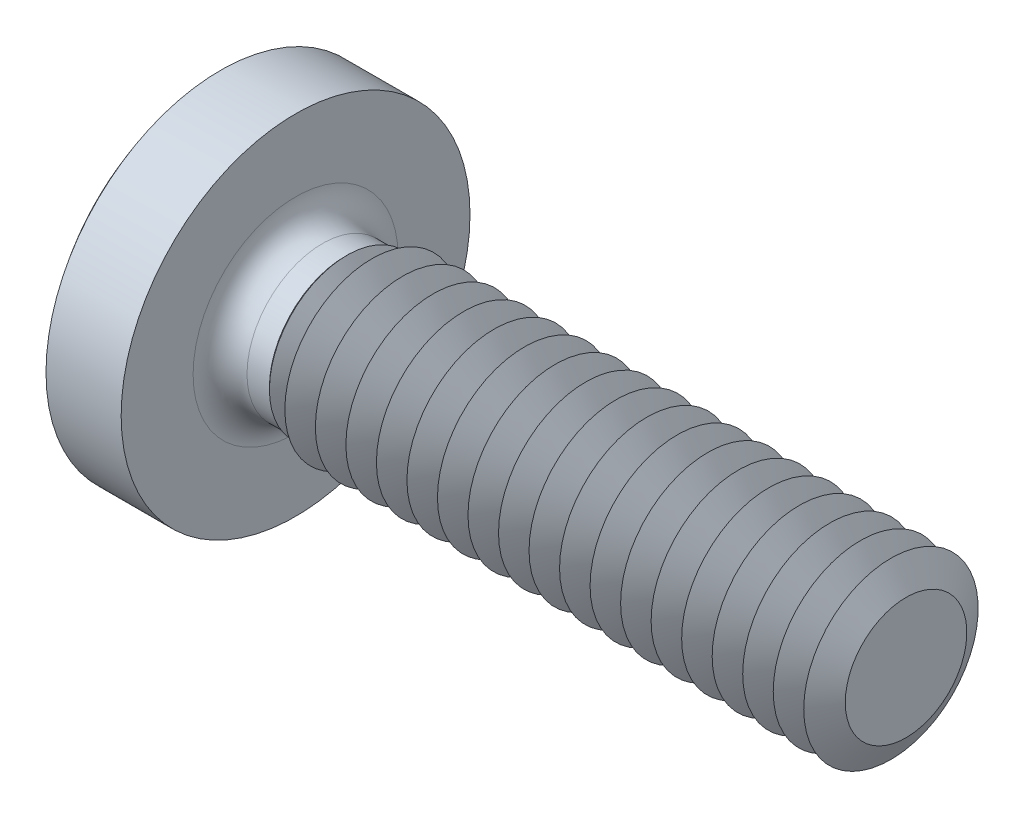
ISO-10303-21;
HEADER;
FILE_DESCRIPTION(('STEP AP214'),'2;1');
FILE_NAME('part.step','',(''),(''),'','','');
FILE_SCHEMA(('AUTOMOTIVE_DESIGN { 1 0 10303 214 1 1 1 1 }'));
ENDSEC;
DATA;
#1=APPLICATION_CONTEXT('core data for automotive mechanical design processes');
#2=APPLICATION_PROTOCOL_DEFINITION('international standard','automotive_design',2000,#1);
#3=PRODUCT_CONTEXT('',#1,'mechanical');
#4=PRODUCT('Part','Part','',(#3));
#5=PRODUCT_RELATED_PRODUCT_CATEGORY('part','',(#4));
#6=PRODUCT_DEFINITION_FORMATION('','',#4);
#7=PRODUCT_DEFINITION_CONTEXT('part definition',#1,'design');
#8=PRODUCT_DEFINITION('design','',#6,#7);
#9=PRODUCT_DEFINITION_SHAPE('','',#8);
#10=(LENGTH_UNIT() NAMED_UNIT(*) SI_UNIT(.MILLI.,.METRE.));
#11=(NAMED_UNIT(*) PLANE_ANGLE_UNIT() SI_UNIT($,.RADIAN.));
#12=(NAMED_UNIT(*) SI_UNIT($,.STERADIAN.) SOLID_ANGLE_UNIT());
#13=UNCERTAINTY_MEASURE_WITH_UNIT(LENGTH_MEASURE(1.E-05),#10,'distance_accuracy_value','');
#14=(GEOMETRIC_REPRESENTATION_CONTEXT(3) GLOBAL_UNCERTAINTY_ASSIGNED_CONTEXT((#13)) GLOBAL_UNIT_ASSIGNED_CONTEXT((#10,
#11,#12)) REPRESENTATION_CONTEXT('',''));
#15=CARTESIAN_POINT('',(0.,0.,0.));
#16=DIRECTION('',(0.,0.,1.));
#17=DIRECTION('',(1.,0.,0.));
#18=AXIS2_PLACEMENT_3D('',#15,#16,#17);
#19=CARTESIAN_POINT('',(2.4,0.,0.));
#20=DIRECTION('',(0.144306893071729,0.,-0.989532981063282));
#21=DIRECTION('',(-0.989532981063282,0.,-0.144306893071729));
#22=AXIS2_PLACEMENT_3D('',#19,#20,#21);
#23=PLANE('',#22);
#24=DIRECTION('',(-0.732931208059297,-0.671853607387689,-0.106885801175314));
#25=VECTOR('',#24,1.);
#26=CARTESIAN_POINT('',(2.4,0.,0.));
#27=LINE('',#26,#25);
#28=CARTESIAN_POINT('',(2.4,0.,0.));
#29=VERTEX_POINT('',#28);
#30=CARTESIAN_POINT('',(0.299339193338267,-1.92560573943992,-0.30634636763817));
#31=VERTEX_POINT('',#30);
#32=EDGE_CURVE('E160',#29,#31,#27,.T.);
#33=ORIENTED_EDGE('',*,*,#32,.F.);
#34=DIRECTION('',(-0.979387903800927,-0.142827402637635,-0.142827402637635));
#35=VECTOR('',#34,1.);
#36=CARTESIAN_POINT('',(2.4,0.,0.));
#37=LINE('',#36,#35);
#38=CARTESIAN_POINT('',(0.0185820115886168,-0.347290123309992,-0.347290123309993));
#39=VERTEX_POINT('',#38);
#40=EDGE_CURVE('E121',#29,#39,#37,.T.);
#41=ORIENTED_EDGE('',*,*,#40,.T.);
#42=CARTESIAN_POINT('',(6.41461963450914,0.,0.585465363365916));
#43=DIRECTION('',(0.144306893071729,0.,-0.989532981063282));
#44=DIRECTION('',(-0.989532981063282,0.,-0.144306893071729));
#45=AXIS2_PLACEMENT_3D('',#42,#43,#44);
#46=CIRCLE('',#45,6.47301633718682);
#47=EDGE_CURVE('E134',#31,#39,#46,.T.);
#48=ORIENTED_EDGE('',*,*,#47,.F.);
#49=EDGE_LOOP('',(#33,#41,#48));
#50=FACE_BOUND('',#49,.T.);
#51=ADVANCED_FACE('F41',(#50),#23,.F.);
#52=CARTESIAN_POINT('',(2.4,0.,0.));
#53=DIRECTION('',(0.144306893071729,0.,0.989532981063282));
#54=DIRECTION('',(0.989532981063282,0.,-0.144306893071729));
#55=AXIS2_PLACEMENT_3D('',#52,#53,#54);
#56=PLANE('',#55);
#57=CARTESIAN_POINT('',(6.41461963450914,0.,-0.585465363365916));
#58=DIRECTION('',(0.144306893071729,0.,0.989532981063282));
#59=DIRECTION('',(0.989532981063282,0.,-0.144306893071729));
#60=AXIS2_PLACEMENT_3D('',#57,#58,#59);
#61=CIRCLE('',#60,6.47301633718682);
#62=CARTESIAN_POINT('',(0.0185820115886177,-0.347290123309995,0.347290123309993));
#63=VERTEX_POINT('',#62);
#64=CARTESIAN_POINT('',(0.299339193338266,-1.92560573943992,0.30634636763817));
#65=VERTEX_POINT('',#64);
#66=EDGE_CURVE('E64',#63,#65,#61,.T.);
#67=ORIENTED_EDGE('',*,*,#66,.F.);
#68=DIRECTION('',(0.979387903800927,0.142827402637636,-0.142827402637635));
#69=VECTOR('',#68,1.);
#70=CARTESIAN_POINT('',(2.4,0.,0.));
#71=LINE('',#70,#69);
#72=EDGE_CURVE('E11',#63,#29,#71,.T.);
#73=ORIENTED_EDGE('',*,*,#72,.T.);
#74=DIRECTION('',(-0.732931208059297,-0.671853607387689,0.106885801175314));
#75=VECTOR('',#74,1.);
#76=CARTESIAN_POINT('',(2.4,0.,0.));
#77=LINE('',#76,#75);
#78=EDGE_CURVE('E161',#29,#65,#77,.T.);
#79=ORIENTED_EDGE('',*,*,#78,.T.);
#80=EDGE_LOOP('',(#67,#73,#79));
#81=FACE_BOUND('',#80,.T.);
#82=ADVANCED_FACE('F176',(#81),#56,.F.);
#83=CARTESIAN_POINT('',(14.6537912040211,0.,0.));
#84=DIRECTION('',(-1.,0.,0.));
#85=DIRECTION('',(0.,0.,1.));
#86=AXIS2_PLACEMENT_3D('',#83,#84,#85);
#87=CONICAL_SURFACE('',#86,2.,1.05188801855302);
#88=CARTESIAN_POINT('',(15.,0.,0.));
#89=DIRECTION('',(-1.,0.,0.));
#90=DIRECTION('',(0.,0.,1.));
#91=AXIS2_PLACEMENT_3D('',#88,#89,#90);
#92=CIRCLE('',#91,1.3938);
#93=CARTESIAN_POINT('',(15.,0.,1.3938));
#94=VERTEX_POINT('',#93);
#95=EDGE_CURVE('E282',#94,#94,#92,.T.);
#96=ORIENTED_EDGE('',*,*,#95,.T.);
#97=EDGE_LOOP('',(#96));
#98=FACE_BOUND('',#97,.T.);
#99=CARTESIAN_POINT('',(14.6537912040211,0.,0.));
#100=DIRECTION('',(-1.,0.,0.));
#101=DIRECTION('',(0.,0.,1.));
#102=AXIS2_PLACEMENT_3D('',#99,#100,#101);
#103=CIRCLE('',#102,2.);
#104=CARTESIAN_POINT('',(14.6537912040211,0.,2.));
#105=VERTEX_POINT('',#104);
#106=EDGE_CURVE('E279',#105,#105,#103,.T.);
#107=ORIENTED_EDGE('',*,*,#106,.F.);
#108=EDGE_LOOP('',(#107));
#109=FACE_BOUND('',#108,.T.);
#110=ADVANCED_FACE('F365',(#98,#109),#87,.T.);
#111=CARTESIAN_POINT('',(15.,0.,0.));
#112=DIRECTION('',(1.,0.,0.));
#113=DIRECTION('',(0.,0.,-1.));
#114=AXIS2_PLACEMENT_3D('',#111,#112,#113);
#115=CONICAL_SURFACE('',#114,1.3938,1.04250708384017);
#116=CARTESIAN_POINT('',(15.3537912040211,0.,0.));
#117=DIRECTION('',(-1.,0.,0.));
#118=DIRECTION('',(0.,0.,1.));
#119=AXIS2_PLACEMENT_3D('',#116,#117,#118);
#120=CIRCLE('',#119,2.);
#121=CARTESIAN_POINT('',(15.3537912040211,0.,2.));
#122=VERTEX_POINT('',#121);
#123=EDGE_CURVE('E285',#122,#122,#120,.T.);
#124=ORIENTED_EDGE('',*,*,#123,.T.);
#125=EDGE_LOOP('',(#124));
#126=FACE_BOUND('',#125,.T.);
#127=ORIENTED_EDGE('',*,*,#95,.F.);
#128=EDGE_LOOP('',(#127));
#129=FACE_BOUND('',#128,.T.);
#130=ADVANCED_FACE('F822',(#126,#129),#115,.T.);
#131=CARTESIAN_POINT('',(17.1,0.,0.));
#132=DIRECTION('',(-1.,0.,0.));
#133=DIRECTION('',(0.,0.,1.));
#134=AXIS2_PLACEMENT_3D('',#131,#132,#133);
#135=PLANE('',#134);
#136=CARTESIAN_POINT('',(17.1,0.,0.));
#137=DIRECTION('',(-1.,0.,0.));
#138=DIRECTION('',(0.,0.,1.));
#139=AXIS2_PLACEMENT_3D('',#136,#137,#138);
#140=CIRCLE('',#139,1.3938);
#141=CARTESIAN_POINT('',(17.1,0.,1.3938));
#142=VERTEX_POINT('',#141);
#143=EDGE_CURVE('E300',#142,#142,#140,.T.);
#144=ORIENTED_EDGE('',*,*,#143,.F.);
#145=EDGE_LOOP('',(#144));
#146=FACE_BOUND('',#145,.T.);
#147=ADVANCED_FACE('F826',(#146),#135,.F.);
#148=CARTESIAN_POINT('',(16.7537912040211,0.,0.));
#149=DIRECTION('',(-1.,0.,0.));
#150=DIRECTION('',(0.,0.,1.));
#151=AXIS2_PLACEMENT_3D('',#148,#149,#150);
#152=CONICAL_SURFACE('',#151,2.,1.05188801855302);
#153=ORIENTED_EDGE('',*,*,#143,.T.);
#154=EDGE_LOOP('',(#153));
#155=FACE_BOUND('',#154,.T.);
#156=CARTESIAN_POINT('',(16.7537912040211,0.,0.));
#157=DIRECTION('',(-1.,0.,0.));
#158=DIRECTION('',(0.,0.,1.));
#159=AXIS2_PLACEMENT_3D('',#156,#157,#158);
#160=CIRCLE('',#159,2.);
#161=CARTESIAN_POINT('',(16.7537912040211,0.,2.));
#162=VERTEX_POINT('',#161);
#163=EDGE_CURVE('E297',#162,#162,#160,.T.);
#164=ORIENTED_EDGE('',*,*,#163,.F.);
#165=EDGE_LOOP('',(#164));
#166=FACE_BOUND('',#165,.T.);
#167=ADVANCED_FACE('F813',(#155,#166),#152,.T.);
#168=CARTESIAN_POINT('',(16.4,0.,0.));
#169=DIRECTION('',(1.,0.,0.));
#170=DIRECTION('',(0.,0.,-1.));
#171=AXIS2_PLACEMENT_3D('',#168,#169,#170);
#172=CONICAL_SURFACE('',#171,1.3938,1.04250708384017);
#173=ORIENTED_EDGE('',*,*,#163,.T.);
#174=EDGE_LOOP('',(#173));
#175=FACE_BOUND('',#174,.T.);
#176=CARTESIAN_POINT('',(16.4,0.,0.));
#177=DIRECTION('',(-1.,0.,0.));
#178=DIRECTION('',(0.,0.,1.));
#179=AXIS2_PLACEMENT_3D('',#176,#177,#178);
#180=CIRCLE('',#179,1.3938);
#181=CARTESIAN_POINT('',(16.4,0.,1.3938));
#182=VERTEX_POINT('',#181);
#183=EDGE_CURVE('E294',#182,#182,#180,.T.);
#184=ORIENTED_EDGE('',*,*,#183,.F.);
#185=EDGE_LOOP('',(#184));
#186=FACE_BOUND('',#185,.T.);
#187=ADVANCED_FACE('F802',(#175,#186),#172,.T.);
#188=CARTESIAN_POINT('',(16.0537912040211,0.,0.));
#189=DIRECTION('',(-1.,0.,0.));
#190=DIRECTION('',(0.,0.,1.));
#191=AXIS2_PLACEMENT_3D('',#188,#189,#190);
#192=CONICAL_SURFACE('',#191,2.,1.05188801855302);
#193=ORIENTED_EDGE('',*,*,#183,.T.);
#194=EDGE_LOOP('',(#193));
#195=FACE_BOUND('',#194,.T.);
#196=CARTESIAN_POINT('',(16.0537912040211,0.,0.));
#197=DIRECTION('',(-1.,0.,0.));
#198=DIRECTION('',(0.,0.,1.));
#199=AXIS2_PLACEMENT_3D('',#196,#197,#198);
#200=CIRCLE('',#199,2.);
#201=CARTESIAN_POINT('',(16.0537912040211,0.,2.));
#202=VERTEX_POINT('',#201);
#203=EDGE_CURVE('E291',#202,#202,#200,.T.);
#204=ORIENTED_EDGE('',*,*,#203,.F.);
#205=EDGE_LOOP('',(#204));
#206=FACE_BOUND('',#205,.T.);
#207=ADVANCED_FACE('F791',(#195,#206),#192,.T.);
#208=CARTESIAN_POINT('',(15.7,0.,0.));
#209=DIRECTION('',(1.,0.,0.));
#210=DIRECTION('',(0.,0.,-1.));
#211=AXIS2_PLACEMENT_3D('',#208,#209,#210);
#212=CONICAL_SURFACE('',#211,1.3938,1.04250708384017);
#213=ORIENTED_EDGE('',*,*,#203,.T.);
#214=EDGE_LOOP('',(#213));
#215=FACE_BOUND('',#214,.T.);
#216=CARTESIAN_POINT('',(15.7,0.,0.));
#217=DIRECTION('',(-1.,0.,0.));
#218=DIRECTION('',(0.,0.,1.));
#219=AXIS2_PLACEMENT_3D('',#216,#217,#218);
#220=CIRCLE('',#219,1.3938);
#221=CARTESIAN_POINT('',(15.7,0.,1.3938));
#222=VERTEX_POINT('',#221);
#223=EDGE_CURVE('E288',#222,#222,#220,.T.);
#224=ORIENTED_EDGE('',*,*,#223,.F.);
#225=EDGE_LOOP('',(#224));
#226=FACE_BOUND('',#225,.T.);
#227=ADVANCED_FACE('F780',(#215,#226),#212,.T.);
#228=CARTESIAN_POINT('',(15.3537912040211,0.,0.));
#229=DIRECTION('',(-1.,0.,0.));
#230=DIRECTION('',(0.,0.,1.));
#231=AXIS2_PLACEMENT_3D('',#228,#229,#230);
#232=CONICAL_SURFACE('',#231,2.,1.05188801855302);
#233=ORIENTED_EDGE('',*,*,#223,.T.);
#234=EDGE_LOOP('',(#233));
#235=FACE_BOUND('',#234,.T.);
#236=ORIENTED_EDGE('',*,*,#123,.F.);
#237=EDGE_LOOP('',(#236));
#238=FACE_BOUND('',#237,.T.);
#239=ADVANCED_FACE('F769',(#235,#238),#232,.T.);
#240=CARTESIAN_POINT('',(13.9537912040211,0.,0.));
#241=DIRECTION('',(-1.,0.,0.));
#242=DIRECTION('',(0.,0.,1.));
#243=AXIS2_PLACEMENT_3D('',#240,#241,#242);
#244=CONICAL_SURFACE('',#243,2.,1.05188801855302);
#245=CARTESIAN_POINT('',(14.3,0.,0.));
#246=DIRECTION('',(-1.,0.,0.));
#247=DIRECTION('',(0.,0.,1.));
#248=AXIS2_PLACEMENT_3D('',#245,#246,#247);
#249=CIRCLE('',#248,1.3938);
#250=CARTESIAN_POINT('',(14.3,0.,1.3938));
#251=VERTEX_POINT('',#250);
#252=EDGE_CURVE('E276',#251,#251,#249,.T.);
#253=ORIENTED_EDGE('',*,*,#252,.T.);
#254=EDGE_LOOP('',(#253));
#255=FACE_BOUND('',#254,.T.);
#256=CARTESIAN_POINT('',(13.9537912040211,0.,0.));
#257=DIRECTION('',(-1.,0.,0.));
#258=DIRECTION('',(0.,0.,1.));
#259=AXIS2_PLACEMENT_3D('',#256,#257,#258);
#260=CIRCLE('',#259,2.);
#261=CARTESIAN_POINT('',(13.9537912040211,0.,2.));
#262=VERTEX_POINT('',#261);
#263=EDGE_CURVE('E273',#262,#262,#260,.T.);
#264=ORIENTED_EDGE('',*,*,#263,.F.);
#265=EDGE_LOOP('',(#264));
#266=FACE_BOUND('',#265,.T.);
#267=ADVANCED_FACE('F758',(#255,#266),#244,.T.);
#268=CARTESIAN_POINT('',(14.3,0.,0.));
#269=DIRECTION('',(1.,0.,0.));
#270=DIRECTION('',(0.,0.,-1.));
#271=AXIS2_PLACEMENT_3D('',#268,#269,#270);
#272=CONICAL_SURFACE('',#271,1.3938,1.04250708384017);
#273=ORIENTED_EDGE('',*,*,#106,.T.);
#274=EDGE_LOOP('',(#273));
#275=FACE_BOUND('',#274,.T.);
#276=ORIENTED_EDGE('',*,*,#252,.F.);
#277=EDGE_LOOP('',(#276));
#278=FACE_BOUND('',#277,.T.);
#279=ADVANCED_FACE('F747',(#275,#278),#272,.T.);
#280=CARTESIAN_POINT('',(13.2537912040211,0.,0.));
#281=DIRECTION('',(-1.,0.,0.));
#282=DIRECTION('',(0.,0.,1.));
#283=AXIS2_PLACEMENT_3D('',#280,#281,#282);
#284=CONICAL_SURFACE('',#283,2.,1.05188801855302);
#285=CARTESIAN_POINT('',(13.6,0.,0.));
#286=DIRECTION('',(-1.,0.,0.));
#287=DIRECTION('',(0.,0.,1.));
#288=AXIS2_PLACEMENT_3D('',#285,#286,#287);
#289=CIRCLE('',#288,1.3938);
#290=CARTESIAN_POINT('',(13.6,0.,1.3938));
#291=VERTEX_POINT('',#290);
#292=EDGE_CURVE('E270',#291,#291,#289,.T.);
#293=ORIENTED_EDGE('',*,*,#292,.T.);
#294=EDGE_LOOP('',(#293));
#295=FACE_BOUND('',#294,.T.);
#296=CARTESIAN_POINT('',(13.2537912040211,0.,0.));
#297=DIRECTION('',(-1.,0.,0.));
#298=DIRECTION('',(0.,0.,1.));
#299=AXIS2_PLACEMENT_3D('',#296,#297,#298);
#300=CIRCLE('',#299,2.);
#301=CARTESIAN_POINT('',(13.2537912040211,0.,2.));
#302=VERTEX_POINT('',#301);
#303=EDGE_CURVE('E267',#302,#302,#300,.T.);
#304=ORIENTED_EDGE('',*,*,#303,.F.);
#305=EDGE_LOOP('',(#304));
#306=FACE_BOUND('',#305,.T.);
#307=ADVANCED_FACE('F736',(#295,#306),#284,.T.);
#308=CARTESIAN_POINT('',(13.6,0.,0.));
#309=DIRECTION('',(1.,0.,0.));
#310=DIRECTION('',(0.,0.,-1.));
#311=AXIS2_PLACEMENT_3D('',#308,#309,#310);
#312=CONICAL_SURFACE('',#311,1.3938,1.04250708384017);
#313=ORIENTED_EDGE('',*,*,#263,.T.);
#314=EDGE_LOOP('',(#313));
#315=FACE_BOUND('',#314,.T.);
#316=ORIENTED_EDGE('',*,*,#292,.F.);
#317=EDGE_LOOP('',(#316));
#318=FACE_BOUND('',#317,.T.);
#319=ADVANCED_FACE('F725',(#315,#318),#312,.T.);
#320=CARTESIAN_POINT('',(12.5537912040211,0.,0.));
#321=DIRECTION('',(-1.,0.,0.));
#322=DIRECTION('',(0.,0.,1.));
#323=AXIS2_PLACEMENT_3D('',#320,#321,#322);
#324=CONICAL_SURFACE('',#323,2.,1.05188801855302);
#325=CARTESIAN_POINT('',(12.9,0.,0.));
#326=DIRECTION('',(-1.,0.,0.));
#327=DIRECTION('',(0.,0.,1.));
#328=AXIS2_PLACEMENT_3D('',#325,#326,#327);
#329=CIRCLE('',#328,1.3938);
#330=CARTESIAN_POINT('',(12.9,0.,1.3938));
#331=VERTEX_POINT('',#330);
#332=EDGE_CURVE('E264',#331,#331,#329,.T.);
#333=ORIENTED_EDGE('',*,*,#332,.T.);
#334=EDGE_LOOP('',(#333));
#335=FACE_BOUND('',#334,.T.);
#336=CARTESIAN_POINT('',(12.5537912040211,0.,0.));
#337=DIRECTION('',(-1.,0.,0.));
#338=DIRECTION('',(0.,0.,1.));
#339=AXIS2_PLACEMENT_3D('',#336,#337,#338);
#340=CIRCLE('',#339,2.);
#341=CARTESIAN_POINT('',(12.5537912040211,0.,2.));
#342=VERTEX_POINT('',#341);
#343=EDGE_CURVE('E261',#342,#342,#340,.T.);
#344=ORIENTED_EDGE('',*,*,#343,.F.);
#345=EDGE_LOOP('',(#344));
#346=FACE_BOUND('',#345,.T.);
#347=ADVANCED_FACE('F714',(#335,#346),#324,.T.);
#348=CARTESIAN_POINT('',(12.9,0.,0.));
#349=DIRECTION('',(1.,0.,0.));
#350=DIRECTION('',(0.,0.,-1.));
#351=AXIS2_PLACEMENT_3D('',#348,#349,#350);
#352=CONICAL_SURFACE('',#351,1.3938,1.04250708384017);
#353=ORIENTED_EDGE('',*,*,#303,.T.);
#354=EDGE_LOOP('',(#353));
#355=FACE_BOUND('',#354,.T.);
#356=ORIENTED_EDGE('',*,*,#332,.F.);
#357=EDGE_LOOP('',(#356));
#358=FACE_BOUND('',#357,.T.);
#359=ADVANCED_FACE('F703',(#355,#358),#352,.T.);
#360=CARTESIAN_POINT('',(11.8537912040211,0.,0.));
#361=DIRECTION('',(-1.,0.,0.));
#362=DIRECTION('',(0.,0.,1.));
#363=AXIS2_PLACEMENT_3D('',#360,#361,#362);
#364=CONICAL_SURFACE('',#363,2.,1.05188801855302);
#365=CARTESIAN_POINT('',(12.2,0.,0.));
#366=DIRECTION('',(-1.,0.,0.));
#367=DIRECTION('',(0.,0.,1.));
#368=AXIS2_PLACEMENT_3D('',#365,#366,#367);
#369=CIRCLE('',#368,1.3938);
#370=CARTESIAN_POINT('',(12.2,0.,1.3938));
#371=VERTEX_POINT('',#370);
#372=EDGE_CURVE('E258',#371,#371,#369,.T.);
#373=ORIENTED_EDGE('',*,*,#372,.T.);
#374=EDGE_LOOP('',(#373));
#375=FACE_BOUND('',#374,.T.);
#376=CARTESIAN_POINT('',(11.8537912040211,0.,0.));
#377=DIRECTION('',(-1.,0.,0.));
#378=DIRECTION('',(0.,0.,1.));
#379=AXIS2_PLACEMENT_3D('',#376,#377,#378);
#380=CIRCLE('',#379,2.);
#381=CARTESIAN_POINT('',(11.8537912040211,0.,2.));
#382=VERTEX_POINT('',#381);
#383=EDGE_CURVE('E255',#382,#382,#380,.T.);
#384=ORIENTED_EDGE('',*,*,#383,.F.);
#385=EDGE_LOOP('',(#384));
#386=FACE_BOUND('',#385,.T.);
#387=ADVANCED_FACE('F692',(#375,#386),#364,.T.);
#388=CARTESIAN_POINT('',(12.2,0.,0.));
#389=DIRECTION('',(1.,0.,0.));
#390=DIRECTION('',(0.,0.,-1.));
#391=AXIS2_PLACEMENT_3D('',#388,#389,#390);
#392=CONICAL_SURFACE('',#391,1.3938,1.04250708384017);
#393=ORIENTED_EDGE('',*,*,#343,.T.);
#394=EDGE_LOOP('',(#393));
#395=FACE_BOUND('',#394,.T.);
#396=ORIENTED_EDGE('',*,*,#372,.F.);
#397=EDGE_LOOP('',(#396));
#398=FACE_BOUND('',#397,.T.);
#399=ADVANCED_FACE('F681',(#395,#398),#392,.T.);
#400=CARTESIAN_POINT('',(11.1537912040211,0.,0.));
#401=DIRECTION('',(-1.,0.,0.));
#402=DIRECTION('',(0.,0.,1.));
#403=AXIS2_PLACEMENT_3D('',#400,#401,#402);
#404=CONICAL_SURFACE('',#403,2.,1.05188801855302);
#405=CARTESIAN_POINT('',(11.5,0.,0.));
#406=DIRECTION('',(-1.,0.,0.));
#407=DIRECTION('',(0.,0.,1.));
#408=AXIS2_PLACEMENT_3D('',#405,#406,#407);
#409=CIRCLE('',#408,1.3938);
#410=CARTESIAN_POINT('',(11.5,0.,1.3938));
#411=VERTEX_POINT('',#410);
#412=EDGE_CURVE('E252',#411,#411,#409,.T.);
#413=ORIENTED_EDGE('',*,*,#412,.T.);
#414=EDGE_LOOP('',(#413));
#415=FACE_BOUND('',#414,.T.);
#416=CARTESIAN_POINT('',(11.1537912040211,0.,0.));
#417=DIRECTION('',(-1.,0.,0.));
#418=DIRECTION('',(0.,0.,1.));
#419=AXIS2_PLACEMENT_3D('',#416,#417,#418);
#420=CIRCLE('',#419,2.);
#421=CARTESIAN_POINT('',(11.1537912040211,0.,2.));
#422=VERTEX_POINT('',#421);
#423=EDGE_CURVE('E249',#422,#422,#420,.T.);
#424=ORIENTED_EDGE('',*,*,#423,.F.);
#425=EDGE_LOOP('',(#424));
#426=FACE_BOUND('',#425,.T.);
#427=ADVANCED_FACE('F670',(#415,#426),#404,.T.);
#428=CARTESIAN_POINT('',(11.5,0.,0.));
#429=DIRECTION('',(1.,0.,0.));
#430=DIRECTION('',(0.,0.,-1.));
#431=AXIS2_PLACEMENT_3D('',#428,#429,#430);
#432=CONICAL_SURFACE('',#431,1.3938,1.04250708384017);
#433=ORIENTED_EDGE('',*,*,#383,.T.);
#434=EDGE_LOOP('',(#433));
#435=FACE_BOUND('',#434,.T.);
#436=ORIENTED_EDGE('',*,*,#412,.F.);
#437=EDGE_LOOP('',(#436));
#438=FACE_BOUND('',#437,.T.);
#439=ADVANCED_FACE('F659',(#435,#438),#432,.T.);
#440=CARTESIAN_POINT('',(10.4537912040211,0.,0.));
#441=DIRECTION('',(-1.,0.,0.));
#442=DIRECTION('',(0.,0.,1.));
#443=AXIS2_PLACEMENT_3D('',#440,#441,#442);
#444=CONICAL_SURFACE('',#443,2.,1.05188801855302);
#445=CARTESIAN_POINT('',(10.8,0.,0.));
#446=DIRECTION('',(-1.,0.,0.));
#447=DIRECTION('',(0.,0.,1.));
#448=AXIS2_PLACEMENT_3D('',#445,#446,#447);
#449=CIRCLE('',#448,1.3938);
#450=CARTESIAN_POINT('',(10.8,0.,1.3938));
#451=VERTEX_POINT('',#450);
#452=EDGE_CURVE('E246',#451,#451,#449,.T.);
#453=ORIENTED_EDGE('',*,*,#452,.T.);
#454=EDGE_LOOP('',(#453));
#455=FACE_BOUND('',#454,.T.);
#456=CARTESIAN_POINT('',(10.4537912040211,0.,0.));
#457=DIRECTION('',(-1.,0.,0.));
#458=DIRECTION('',(0.,0.,1.));
#459=AXIS2_PLACEMENT_3D('',#456,#457,#458);
#460=CIRCLE('',#459,2.);
#461=CARTESIAN_POINT('',(10.4537912040211,0.,2.));
#462=VERTEX_POINT('',#461);
#463=EDGE_CURVE('E243',#462,#462,#460,.T.);
#464=ORIENTED_EDGE('',*,*,#463,.F.);
#465=EDGE_LOOP('',(#464));
#466=FACE_BOUND('',#465,.T.);
#467=ADVANCED_FACE('F648',(#455,#466),#444,.T.);
#468=CARTESIAN_POINT('',(10.8,0.,0.));
#469=DIRECTION('',(1.,0.,0.));
#470=DIRECTION('',(0.,0.,-1.));
#471=AXIS2_PLACEMENT_3D('',#468,#469,#470);
#472=CONICAL_SURFACE('',#471,1.3938,1.04250708384017);
#473=ORIENTED_EDGE('',*,*,#423,.T.);
#474=EDGE_LOOP('',(#473));
#475=FACE_BOUND('',#474,.T.);
#476=ORIENTED_EDGE('',*,*,#452,.F.);
#477=EDGE_LOOP('',(#476));
#478=FACE_BOUND('',#477,.T.);
#479=ADVANCED_FACE('F637',(#475,#478),#472,.T.);
#480=CARTESIAN_POINT('',(9.75379120402108,0.,0.));
#481=DIRECTION('',(-1.,0.,0.));
#482=DIRECTION('',(0.,0.,1.));
#483=AXIS2_PLACEMENT_3D('',#480,#481,#482);
#484=CONICAL_SURFACE('',#483,2.,1.05188801855302);
#485=CARTESIAN_POINT('',(10.1,0.,0.));
#486=DIRECTION('',(-1.,0.,0.));
#487=DIRECTION('',(0.,0.,1.));
#488=AXIS2_PLACEMENT_3D('',#485,#486,#487);
#489=CIRCLE('',#488,1.3938);
#490=CARTESIAN_POINT('',(10.1,0.,1.3938));
#491=VERTEX_POINT('',#490);
#492=EDGE_CURVE('E240',#491,#491,#489,.T.);
#493=ORIENTED_EDGE('',*,*,#492,.T.);
#494=EDGE_LOOP('',(#493));
#495=FACE_BOUND('',#494,.T.);
#496=CARTESIAN_POINT('',(9.75379120402108,0.,0.));
#497=DIRECTION('',(-1.,0.,0.));
#498=DIRECTION('',(0.,0.,1.));
#499=AXIS2_PLACEMENT_3D('',#496,#497,#498);
#500=CIRCLE('',#499,2.);
#501=CARTESIAN_POINT('',(9.75379120402108,0.,2.));
#502=VERTEX_POINT('',#501);
#503=EDGE_CURVE('E237',#502,#502,#500,.T.);
#504=ORIENTED_EDGE('',*,*,#503,.F.);
#505=EDGE_LOOP('',(#504));
#506=FACE_BOUND('',#505,.T.);
#507=ADVANCED_FACE('F626',(#495,#506),#484,.T.);
#508=CARTESIAN_POINT('',(10.1,0.,0.));
#509=DIRECTION('',(1.,0.,0.));
#510=DIRECTION('',(0.,0.,-1.));
#511=AXIS2_PLACEMENT_3D('',#508,#509,#510);
#512=CONICAL_SURFACE('',#511,1.3938,1.04250708384017);
#513=ORIENTED_EDGE('',*,*,#463,.T.);
#514=EDGE_LOOP('',(#513));
#515=FACE_BOUND('',#514,.T.);
#516=ORIENTED_EDGE('',*,*,#492,.F.);
#517=EDGE_LOOP('',(#516));
#518=FACE_BOUND('',#517,.T.);
#519=ADVANCED_FACE('F615',(#515,#518),#512,.T.);
#520=CARTESIAN_POINT('',(9.05379120402107,0.,0.));
#521=DIRECTION('',(-1.,0.,0.));
#522=DIRECTION('',(0.,0.,1.));
#523=AXIS2_PLACEMENT_3D('',#520,#521,#522);
#524=CONICAL_SURFACE('',#523,2.,1.05188801855302);
#525=CARTESIAN_POINT('',(9.4,0.,0.));
#526=DIRECTION('',(-1.,0.,0.));
#527=DIRECTION('',(0.,0.,1.));
#528=AXIS2_PLACEMENT_3D('',#525,#526,#527);
#529=CIRCLE('',#528,1.3938);
#530=CARTESIAN_POINT('',(9.4,0.,1.3938));
#531=VERTEX_POINT('',#530);
#532=EDGE_CURVE('E234',#531,#531,#529,.T.);
#533=ORIENTED_EDGE('',*,*,#532,.T.);
#534=EDGE_LOOP('',(#533));
#535=FACE_BOUND('',#534,.T.);
#536=CARTESIAN_POINT('',(9.05379120402108,0.,0.));
#537=DIRECTION('',(-1.,0.,0.));
#538=DIRECTION('',(0.,0.,1.));
#539=AXIS2_PLACEMENT_3D('',#536,#537,#538);
#540=CIRCLE('',#539,2.);
#541=CARTESIAN_POINT('',(9.05379120402108,0.,2.));
#542=VERTEX_POINT('',#541);
#543=EDGE_CURVE('E231',#542,#542,#540,.T.);
#544=ORIENTED_EDGE('',*,*,#543,.F.);
#545=EDGE_LOOP('',(#544));
#546=FACE_BOUND('',#545,.T.);
#547=ADVANCED_FACE('F604',(#535,#546),#524,.T.);
#548=CARTESIAN_POINT('',(9.4,0.,0.));
#549=DIRECTION('',(1.,0.,0.));
#550=DIRECTION('',(0.,0.,-1.));
#551=AXIS2_PLACEMENT_3D('',#548,#549,#550);
#552=CONICAL_SURFACE('',#551,1.3938,1.04250708384017);
#553=ORIENTED_EDGE('',*,*,#503,.T.);
#554=EDGE_LOOP('',(#553));
#555=FACE_BOUND('',#554,.T.);
#556=ORIENTED_EDGE('',*,*,#532,.F.);
#557=EDGE_LOOP('',(#556));
#558=FACE_BOUND('',#557,.T.);
#559=ADVANCED_FACE('F593',(#555,#558),#552,.T.);
#560=CARTESIAN_POINT('',(8.35379120402107,0.,0.));
#561=DIRECTION('',(-1.,0.,0.));
#562=DIRECTION('',(0.,0.,1.));
#563=AXIS2_PLACEMENT_3D('',#560,#561,#562);
#564=CONICAL_SURFACE('',#563,2.,1.05188801855302);
#565=CARTESIAN_POINT('',(8.7,0.,0.));
#566=DIRECTION('',(-1.,0.,0.));
#567=DIRECTION('',(0.,0.,1.));
#568=AXIS2_PLACEMENT_3D('',#565,#566,#567);
#569=CIRCLE('',#568,1.3938);
#570=CARTESIAN_POINT('',(8.7,0.,1.3938));
#571=VERTEX_POINT('',#570);
#572=EDGE_CURVE('E228',#571,#571,#569,.T.);
#573=ORIENTED_EDGE('',*,*,#572,.T.);
#574=EDGE_LOOP('',(#573));
#575=FACE_BOUND('',#574,.T.);
#576=CARTESIAN_POINT('',(8.35379120402108,0.,0.));
#577=DIRECTION('',(-1.,0.,0.));
#578=DIRECTION('',(0.,0.,1.));
#579=AXIS2_PLACEMENT_3D('',#576,#577,#578);
#580=CIRCLE('',#579,2.);
#581=CARTESIAN_POINT('',(8.35379120402108,0.,2.));
#582=VERTEX_POINT('',#581);
#583=EDGE_CURVE('E225',#582,#582,#580,.T.);
#584=ORIENTED_EDGE('',*,*,#583,.F.);
#585=EDGE_LOOP('',(#584));
#586=FACE_BOUND('',#585,.T.);
#587=ADVANCED_FACE('F582',(#575,#586),#564,.T.);
#588=CARTESIAN_POINT('',(8.7,0.,0.));
#589=DIRECTION('',(1.,0.,0.));
#590=DIRECTION('',(0.,0.,-1.));
#591=AXIS2_PLACEMENT_3D('',#588,#589,#590);
#592=CONICAL_SURFACE('',#591,1.3938,1.04250708384017);
#593=ORIENTED_EDGE('',*,*,#543,.T.);
#594=EDGE_LOOP('',(#593));
#595=FACE_BOUND('',#594,.T.);
#596=ORIENTED_EDGE('',*,*,#572,.F.);
#597=EDGE_LOOP('',(#596));
#598=FACE_BOUND('',#597,.T.);
#599=ADVANCED_FACE('F571',(#595,#598),#592,.T.);
#600=CARTESIAN_POINT('',(7.65379120402107,0.,0.));
#601=DIRECTION('',(-1.,0.,0.));
#602=DIRECTION('',(0.,0.,1.));
#603=AXIS2_PLACEMENT_3D('',#600,#601,#602);
#604=CONICAL_SURFACE('',#603,2.,1.05188801855302);
#605=CARTESIAN_POINT('',(8.,0.,0.));
#606=DIRECTION('',(-1.,0.,0.));
#607=DIRECTION('',(0.,0.,1.));
#608=AXIS2_PLACEMENT_3D('',#605,#606,#607);
#609=CIRCLE('',#608,1.3938);
#610=CARTESIAN_POINT('',(8.,0.,1.3938));
#611=VERTEX_POINT('',#610);
#612=EDGE_CURVE('E222',#611,#611,#609,.T.);
#613=ORIENTED_EDGE('',*,*,#612,.T.);
#614=EDGE_LOOP('',(#613));
#615=FACE_BOUND('',#614,.T.);
#616=CARTESIAN_POINT('',(7.65379120402108,0.,0.));
#617=DIRECTION('',(-1.,0.,0.));
#618=DIRECTION('',(0.,0.,1.));
#619=AXIS2_PLACEMENT_3D('',#616,#617,#618);
#620=CIRCLE('',#619,2.);
#621=CARTESIAN_POINT('',(7.65379120402108,0.,2.));
#622=VERTEX_POINT('',#621);
#623=EDGE_CURVE('E219',#622,#622,#620,.T.);
#624=ORIENTED_EDGE('',*,*,#623,.F.);
#625=EDGE_LOOP('',(#624));
#626=FACE_BOUND('',#625,.T.);
#627=ADVANCED_FACE('F560',(#615,#626),#604,.T.);
#628=CARTESIAN_POINT('',(8.,0.,0.));
#629=DIRECTION('',(1.,0.,0.));
#630=DIRECTION('',(0.,0.,-1.));
#631=AXIS2_PLACEMENT_3D('',#628,#629,#630);
#632=CONICAL_SURFACE('',#631,1.3938,1.04250708384017);
#633=ORIENTED_EDGE('',*,*,#583,.T.);
#634=EDGE_LOOP('',(#633));
#635=FACE_BOUND('',#634,.T.);
#636=ORIENTED_EDGE('',*,*,#612,.F.);
#637=EDGE_LOOP('',(#636));
#638=FACE_BOUND('',#637,.T.);
#639=ADVANCED_FACE('F549',(#635,#638),#632,.T.);
#640=CARTESIAN_POINT('',(6.95379120402108,0.,0.));
#641=DIRECTION('',(-1.,0.,0.));
#642=DIRECTION('',(0.,0.,1.));
#643=AXIS2_PLACEMENT_3D('',#640,#641,#642);
#644=CONICAL_SURFACE('',#643,2.,1.05188801855302);
#645=CARTESIAN_POINT('',(7.3,0.,0.));
#646=DIRECTION('',(-1.,0.,0.));
#647=DIRECTION('',(0.,0.,1.));
#648=AXIS2_PLACEMENT_3D('',#645,#646,#647);
#649=CIRCLE('',#648,1.3938);
#650=CARTESIAN_POINT('',(7.3,0.,1.3938));
#651=VERTEX_POINT('',#650);
#652=EDGE_CURVE('E216',#651,#651,#649,.T.);
#653=ORIENTED_EDGE('',*,*,#652,.T.);
#654=EDGE_LOOP('',(#653));
#655=FACE_BOUND('',#654,.T.);
#656=CARTESIAN_POINT('',(6.95379120402108,0.,0.));
#657=DIRECTION('',(-1.,0.,0.));
#658=DIRECTION('',(0.,0.,1.));
#659=AXIS2_PLACEMENT_3D('',#656,#657,#658);
#660=CIRCLE('',#659,2.);
#661=CARTESIAN_POINT('',(6.95379120402108,0.,2.));
#662=VERTEX_POINT('',#661);
#663=EDGE_CURVE('E213',#662,#662,#660,.T.);
#664=ORIENTED_EDGE('',*,*,#663,.F.);
#665=EDGE_LOOP('',(#664));
#666=FACE_BOUND('',#665,.T.);
#667=ADVANCED_FACE('F538',(#655,#666),#644,.T.);
#668=CARTESIAN_POINT('',(7.3,0.,0.));
#669=DIRECTION('',(1.,0.,0.));
#670=DIRECTION('',(0.,0.,-1.));
#671=AXIS2_PLACEMENT_3D('',#668,#669,#670);
#672=CONICAL_SURFACE('',#671,1.3938,1.04250708384017);
#673=ORIENTED_EDGE('',*,*,#623,.T.);
#674=EDGE_LOOP('',(#673));
#675=FACE_BOUND('',#674,.T.);
#676=ORIENTED_EDGE('',*,*,#652,.F.);
#677=EDGE_LOOP('',(#676));
#678=FACE_BOUND('',#677,.T.);
#679=ADVANCED_FACE('F527',(#675,#678),#672,.T.);
#680=CARTESIAN_POINT('',(6.25379120402107,0.,0.));
#681=DIRECTION('',(-1.,0.,0.));
#682=DIRECTION('',(0.,0.,1.));
#683=AXIS2_PLACEMENT_3D('',#680,#681,#682);
#684=CONICAL_SURFACE('',#683,2.,1.05188801855302);
#685=CARTESIAN_POINT('',(6.6,0.,0.));
#686=DIRECTION('',(-1.,0.,0.));
#687=DIRECTION('',(0.,0.,1.));
#688=AXIS2_PLACEMENT_3D('',#685,#686,#687);
#689=CIRCLE('',#688,1.3938);
#690=CARTESIAN_POINT('',(6.6,0.,1.3938));
#691=VERTEX_POINT('',#690);
#692=EDGE_CURVE('E210',#691,#691,#689,.T.);
#693=ORIENTED_EDGE('',*,*,#692,.T.);
#694=EDGE_LOOP('',(#693));
#695=FACE_BOUND('',#694,.T.);
#696=CARTESIAN_POINT('',(6.25379120402109,0.,0.));
#697=DIRECTION('',(-1.,0.,0.));
#698=DIRECTION('',(0.,0.,1.));
#699=AXIS2_PLACEMENT_3D('',#696,#697,#698);
#700=CIRCLE('',#699,2.);
#701=CARTESIAN_POINT('',(6.25379120402109,0.,2.));
#702=VERTEX_POINT('',#701);
#703=EDGE_CURVE('E207',#702,#702,#700,.T.);
#704=ORIENTED_EDGE('',*,*,#703,.F.);
#705=EDGE_LOOP('',(#704));
#706=FACE_BOUND('',#705,.T.);
#707=ADVANCED_FACE('F516',(#695,#706),#684,.T.);
#708=CARTESIAN_POINT('',(6.6,0.,0.));
#709=DIRECTION('',(1.,0.,0.));
#710=DIRECTION('',(0.,0.,-1.));
#711=AXIS2_PLACEMENT_3D('',#708,#709,#710);
#712=CONICAL_SURFACE('',#711,1.3938,1.04250708384017);
#713=ORIENTED_EDGE('',*,*,#663,.T.);
#714=EDGE_LOOP('',(#713));
#715=FACE_BOUND('',#714,.T.);
#716=ORIENTED_EDGE('',*,*,#692,.F.);
#717=EDGE_LOOP('',(#716));
#718=FACE_BOUND('',#717,.T.);
#719=ADVANCED_FACE('F505',(#715,#718),#712,.T.);
#720=CARTESIAN_POINT('',(5.55379120402108,0.,0.));
#721=DIRECTION('',(-1.,0.,0.));
#722=DIRECTION('',(0.,0.,1.));
#723=AXIS2_PLACEMENT_3D('',#720,#721,#722);
#724=CONICAL_SURFACE('',#723,2.,1.05188801855302);
#725=CARTESIAN_POINT('',(5.9,0.,0.));
#726=DIRECTION('',(-1.,0.,0.));
#727=DIRECTION('',(0.,0.,1.));
#728=AXIS2_PLACEMENT_3D('',#725,#726,#727);
#729=CIRCLE('',#728,1.3938);
#730=CARTESIAN_POINT('',(5.9,0.,1.3938));
#731=VERTEX_POINT('',#730);
#732=EDGE_CURVE('E204',#731,#731,#729,.T.);
#733=ORIENTED_EDGE('',*,*,#732,.T.);
#734=EDGE_LOOP('',(#733));
#735=FACE_BOUND('',#734,.T.);
#736=CARTESIAN_POINT('',(5.55379120402109,0.,0.));
#737=DIRECTION('',(-1.,0.,0.));
#738=DIRECTION('',(0.,0.,1.));
#739=AXIS2_PLACEMENT_3D('',#736,#737,#738);
#740=CIRCLE('',#739,2.);
#741=CARTESIAN_POINT('',(5.55379120402109,0.,2.));
#742=VERTEX_POINT('',#741);
#743=EDGE_CURVE('E201',#742,#742,#740,.T.);
#744=ORIENTED_EDGE('',*,*,#743,.F.);
#745=EDGE_LOOP('',(#744));
#746=FACE_BOUND('',#745,.T.);
#747=ADVANCED_FACE('F494',(#735,#746),#724,.T.);
#748=CARTESIAN_POINT('',(5.9,0.,0.));
#749=DIRECTION('',(1.,0.,0.));
#750=DIRECTION('',(0.,0.,-1.));
#751=AXIS2_PLACEMENT_3D('',#748,#749,#750);
#752=CONICAL_SURFACE('',#751,1.3938,1.04250708384017);
#753=ORIENTED_EDGE('',*,*,#703,.T.);
#754=EDGE_LOOP('',(#753));
#755=FACE_BOUND('',#754,.T.);
#756=ORIENTED_EDGE('',*,*,#732,.F.);
#757=EDGE_LOOP('',(#756));
#758=FACE_BOUND('',#757,.T.);
#759=ADVANCED_FACE('F483',(#755,#758),#752,.T.);
#760=CARTESIAN_POINT('',(4.85379120402108,0.,0.));
#761=DIRECTION('',(-1.,0.,0.));
#762=DIRECTION('',(0.,0.,1.));
#763=AXIS2_PLACEMENT_3D('',#760,#761,#762);
#764=CONICAL_SURFACE('',#763,2.,1.05188801855302);
#765=CARTESIAN_POINT('',(5.2,0.,0.));
#766=DIRECTION('',(-1.,0.,0.));
#767=DIRECTION('',(0.,0.,1.));
#768=AXIS2_PLACEMENT_3D('',#765,#766,#767);
#769=CIRCLE('',#768,1.3938);
#770=CARTESIAN_POINT('',(5.2,0.,1.3938));
#771=VERTEX_POINT('',#770);
#772=EDGE_CURVE('E198',#771,#771,#769,.T.);
#773=ORIENTED_EDGE('',*,*,#772,.T.);
#774=EDGE_LOOP('',(#773));
#775=FACE_BOUND('',#774,.T.);
#776=CARTESIAN_POINT('',(4.85379120402108,0.,0.));
#777=DIRECTION('',(-1.,0.,0.));
#778=DIRECTION('',(0.,0.,1.));
#779=AXIS2_PLACEMENT_3D('',#776,#777,#778);
#780=CIRCLE('',#779,2.);
#781=CARTESIAN_POINT('',(4.85379120402108,0.,2.));
#782=VERTEX_POINT('',#781);
#783=EDGE_CURVE('E195',#782,#782,#780,.T.);
#784=ORIENTED_EDGE('',*,*,#783,.F.);
#785=EDGE_LOOP('',(#784));
#786=FACE_BOUND('',#785,.T.);
#787=ADVANCED_FACE('F357',(#775,#786),#764,.T.);
#788=CARTESIAN_POINT('',(5.2,0.,0.));
#789=DIRECTION('',(1.,0.,0.));
#790=DIRECTION('',(0.,0.,-1.));
#791=AXIS2_PLACEMENT_3D('',#788,#789,#790);
#792=CONICAL_SURFACE('',#791,1.3938,1.04250708384017);
#793=ORIENTED_EDGE('',*,*,#743,.T.);
#794=EDGE_LOOP('',(#793));
#795=FACE_BOUND('',#794,.T.);
#796=ORIENTED_EDGE('',*,*,#772,.F.);
#797=EDGE_LOOP('',(#796));
#798=FACE_BOUND('',#797,.T.);
#799=ADVANCED_FACE('F348',(#795,#798),#792,.T.);
#800=CARTESIAN_POINT('',(4.15379120402107,0.,0.));
#801=DIRECTION('',(-1.,0.,0.));
#802=DIRECTION('',(0.,0.,1.));
#803=AXIS2_PLACEMENT_3D('',#800,#801,#802);
#804=CONICAL_SURFACE('',#803,2.,1.05188801855302);
#805=CARTESIAN_POINT('',(4.5,0.,0.));
#806=DIRECTION('',(-1.,0.,0.));
#807=DIRECTION('',(0.,0.,1.));
#808=AXIS2_PLACEMENT_3D('',#805,#806,#807);
#809=CIRCLE('',#808,1.3938);
#810=CARTESIAN_POINT('',(4.5,0.,1.3938));
#811=VERTEX_POINT('',#810);
#812=EDGE_CURVE('E165',#811,#811,#809,.T.);
#813=ORIENTED_EDGE('',*,*,#812,.T.);
#814=EDGE_LOOP('',(#813));
#815=FACE_BOUND('',#814,.T.);
#816=CARTESIAN_POINT('',(4.27964108163584,0.,0.));
#817=DIRECTION('',(-1.,0.,0.));
#818=DIRECTION('',(0.,0.,1.));
#819=AXIS2_PLACEMENT_3D('',#816,#817,#818);
#820=CIRCLE('',#819,1.77964108163585);
#821=CARTESIAN_POINT('',(4.27964108163584,0.,1.77964108163585));
#822=VERTEX_POINT('',#821);
#823=EDGE_CURVE('E184',#822,#822,#820,.F.);
#824=ORIENTED_EDGE('',*,*,#823,.T.);
#825=EDGE_LOOP('',(#824));
#826=FACE_BOUND('',#825,.T.);
#827=ADVANCED_FACE('F345',(#815,#826),#804,.T.);
#828=CARTESIAN_POINT('',(4.5,0.,0.));
#829=DIRECTION('',(1.,0.,0.));
#830=DIRECTION('',(0.,0.,-1.));
#831=AXIS2_PLACEMENT_3D('',#828,#829,#830);
#832=CONICAL_SURFACE('',#831,1.3938,1.04250708384017);
#833=ORIENTED_EDGE('',*,*,#783,.T.);
#834=EDGE_LOOP('',(#833));
#835=FACE_BOUND('',#834,.T.);
#836=ORIENTED_EDGE('',*,*,#812,.F.);
#837=EDGE_LOOP('',(#836));
#838=FACE_BOUND('',#837,.T.);
#839=ADVANCED_FACE('F347',(#835,#838),#832,.T.);
#840=CARTESIAN_POINT('',(6.5,0.,0.));
#841=DIRECTION('',(-1.,0.,0.));
#842=DIRECTION('',(0.,1.,0.));
#843=AXIS2_PLACEMENT_3D('',#840,#841,#842);
#844=SPHERICAL_SURFACE('',#843,6.5);
#845=CARTESIAN_POINT('',(4.62792452830189,0.,-2.0422641509434));
#846=DIRECTION('',(0.675724628517346,0.,0.737154140200741));
#847=DIRECTION('',(0.737154140200741,0.,-0.675724628517346));
#848=AXIS2_PLACEMENT_3D('',#845,#846,#847);
#849=CIRCLE('',#848,5.88000770118864);
#850=CARTESIAN_POINT('',(0.299339193338266,0.306346367638162,1.92560573943992));
#851=VERTEX_POINT('',#850);
#852=CARTESIAN_POINT('',(0.299339193338267,-0.306346367638176,1.92560573943992));
#853=VERTEX_POINT('',#852);
#854=EDGE_CURVE('E127',#851,#853,#849,.T.);
#855=ORIENTED_EDGE('',*,*,#854,.T.);
#856=CARTESIAN_POINT('',(6.41461963450914,0.585465363365916,0.));
#857=DIRECTION('',(0.144306893071729,-0.989532981063282,0.));
#858=DIRECTION('',(0.989532981063282,0.144306893071729,0.));
#859=AXIS2_PLACEMENT_3D('',#856,#857,#858);
#860=CIRCLE('',#859,6.47301633718682);
#861=EDGE_CURVE('E143',#853,#63,#860,.T.);
#862=ORIENTED_EDGE('',*,*,#861,.T.);
#863=ORIENTED_EDGE('',*,*,#66,.T.);
#864=CARTESIAN_POINT('',(4.62792452830189,2.0422641509434,0.));
#865=DIRECTION('',(0.675724628517346,-0.737154140200741,0.));
#866=DIRECTION('',(0.737154140200741,0.675724628517346,0.));
#867=AXIS2_PLACEMENT_3D('',#864,#865,#866);
#868=CIRCLE('',#867,5.88000770118864);
#869=EDGE_CURVE('E173',#65,#31,#868,.T.);
#870=ORIENTED_EDGE('',*,*,#869,.T.);
#871=ORIENTED_EDGE('',*,*,#47,.T.);
#872=CARTESIAN_POINT('',(0.299339193338267,-0.306346367638163,-1.92560573943992));
#873=VERTEX_POINT('',#872);
#874=EDGE_CURVE('E123',#39,#873,#860,.T.);
#875=ORIENTED_EDGE('',*,*,#874,.T.);
#876=CARTESIAN_POINT('',(4.62792452830189,0.,2.0422641509434));
#877=DIRECTION('',(0.675724628517346,0.,-0.737154140200741));
#878=DIRECTION('',(-0.737154140200741,0.,-0.675724628517346));
#879=AXIS2_PLACEMENT_3D('',#876,#877,#878);
#880=CIRCLE('',#879,5.88000770118864);
#881=CARTESIAN_POINT('',(0.299339193338266,0.306346367638176,-1.92560573943992));
#882=VERTEX_POINT('',#881);
#883=EDGE_CURVE('E115',#873,#882,#880,.T.);
#884=ORIENTED_EDGE('',*,*,#883,.T.);
#885=CARTESIAN_POINT('',(6.41461963450914,-0.585465363365916,0.));
#886=DIRECTION('',(0.144306893071729,0.989532981063282,0.));
#887=DIRECTION('',(-0.989532981063282,0.144306893071729,0.));
#888=AXIS2_PLACEMENT_3D('',#885,#886,#887);
#889=CIRCLE('',#888,6.47301633718682);
#890=CARTESIAN_POINT('',(0.0185820115886177,0.347290123309994,-0.347290123309993));
#891=VERTEX_POINT('',#890);
#892=EDGE_CURVE('E106',#882,#891,#889,.T.);
#893=ORIENTED_EDGE('',*,*,#892,.T.);
#894=CARTESIAN_POINT('',(0.299339193338267,1.92560573943992,-0.30634636763817));
#895=VERTEX_POINT('',#894);
#896=EDGE_CURVE('E151',#891,#895,#46,.T.);
#897=ORIENTED_EDGE('',*,*,#896,.T.);
#898=CARTESIAN_POINT('',(4.62792452830189,-2.0422641509434,0.));
#899=DIRECTION('',(0.675724628517346,0.737154140200741,0.));
#900=DIRECTION('',(-0.737154140200741,0.675724628517346,0.));
#901=AXIS2_PLACEMENT_3D('',#898,#899,#900);
#902=CIRCLE('',#901,5.88000770118864);
#903=CARTESIAN_POINT('',(0.299339193338266,1.92560573943992,0.306346367638169));
#904=VERTEX_POINT('',#903);
#905=EDGE_CURVE('E164',#895,#904,#902,.T.);
#906=ORIENTED_EDGE('',*,*,#905,.T.);
#907=CARTESIAN_POINT('',(0.0185820115886168,0.347290123309992,0.347290123309993));
#908=VERTEX_POINT('',#907);
#909=EDGE_CURVE('E156',#904,#908,#61,.T.);
#910=ORIENTED_EDGE('',*,*,#909,.T.);
#911=EDGE_CURVE('E56',#908,#851,#889,.T.);
#912=ORIENTED_EDGE('',*,*,#911,.T.);
#913=EDGE_LOOP('',(#855,#862,#863,#870,#871,#875,#884,#893,#897,#906,#910,#912));
#914=FACE_BOUND('',#913,.T.);
#915=CARTESIAN_POINT('',(1.3765246170202,0.,0.));
#916=DIRECTION('',(-1.,0.,0.));
#917=DIRECTION('',(0.,0.,1.));
#918=AXIS2_PLACEMENT_3D('',#915,#916,#917);
#919=CIRCLE('',#918,4.);
#920=CARTESIAN_POINT('',(1.3765246170202,0.,4.));
#921=VERTEX_POINT('',#920);
#922=EDGE_CURVE('E177',#921,#921,#919,.T.);
#923=ORIENTED_EDGE('',*,*,#922,.T.);
#924=EDGE_LOOP('',(#923));
#925=FACE_BOUND('',#924,.T.);
#926=ADVANCED_FACE('F43',(#914,#925),#844,.T.);
#927=CARTESIAN_POINT('',(-1.33175770411172,0.,0.));
#928=DIRECTION('',(-1.,0.,0.));
#929=DIRECTION('',(0.,0.,1.));
#930=AXIS2_PLACEMENT_3D('',#927,#928,#929);
#931=CYLINDRICAL_SURFACE('',#930,4.);
#932=ORIENTED_EDGE('',*,*,#922,.F.);
#933=EDGE_LOOP('',(#932));
#934=FACE_BOUND('',#933,.T.);
#935=CARTESIAN_POINT('',(3.1,0.,0.));
#936=DIRECTION('',(-1.,0.,0.));
#937=DIRECTION('',(0.,0.,1.));
#938=AXIS2_PLACEMENT_3D('',#935,#936,#937);
#939=CIRCLE('',#938,4.);
#940=CARTESIAN_POINT('',(3.1,0.,4.));
#941=VERTEX_POINT('',#940);
#942=EDGE_CURVE('E180',#941,#941,#939,.T.);
#943=ORIENTED_EDGE('',*,*,#942,.T.);
#944=EDGE_LOOP('',(#943));
#945=FACE_BOUND('',#944,.T.);
#946=ADVANCED_FACE('F318',(#934,#945),#931,.T.);
#947=CARTESIAN_POINT('',(3.1,2.35,0.));
#948=DIRECTION('',(-1.,0.,0.));
#949=DIRECTION('',(0.,0.,1.));
#950=AXIS2_PLACEMENT_3D('',#947,#948,#949);
#951=PLANE('',#950);
#952=ORIENTED_EDGE('',*,*,#942,.F.);
#953=EDGE_LOOP('',(#952));
#954=FACE_BOUND('',#953,.T.);
#955=CARTESIAN_POINT('',(3.1,0.,0.));
#956=DIRECTION('',(-1.,0.,0.));
#957=DIRECTION('',(0.,0.,1.));
#958=AXIS2_PLACEMENT_3D('',#955,#956,#957);
#959=CIRCLE('',#958,2.35);
#960=CARTESIAN_POINT('',(3.1,0.,2.35));
#961=VERTEX_POINT('',#960);
#962=EDGE_CURVE('E309',#961,#961,#959,.T.);
#963=ORIENTED_EDGE('',*,*,#962,.T.);
#964=EDGE_LOOP('',(#963));
#965=FACE_BOUND('',#964,.T.);
#966=ADVANCED_FACE('F320',(#954,#965),#951,.F.);
#967=CARTESIAN_POINT('',(3.718,0.,0.));
#968=DIRECTION('',(-1.,0.,0.));
#969=DIRECTION('',(0.,0.,1.));
#970=AXIS2_PLACEMENT_3D('',#967,#968,#969);
#971=TOROIDAL_SURFACE('',#970,2.35,0.618);
#972=ORIENTED_EDGE('',*,*,#962,.F.);
#973=EDGE_LOOP('',(#972));
#974=FACE_BOUND('',#973,.T.);
#975=CARTESIAN_POINT('',(3.718,0.,0.));
#976=DIRECTION('',(-1.,0.,0.));
#977=DIRECTION('',(0.,0.,1.));
#978=AXIS2_PLACEMENT_3D('',#975,#976,#977);
#979=CIRCLE('',#978,1.732);
#980=CARTESIAN_POINT('',(3.718,0.,1.732));
#981=VERTEX_POINT('',#980);
#982=EDGE_CURVE('E306',#981,#981,#979,.T.);
#983=ORIENTED_EDGE('',*,*,#982,.T.);
#984=EDGE_LOOP('',(#983));
#985=FACE_BOUND('',#984,.T.);
#986=ADVANCED_FACE('F323',(#974,#985),#971,.F.);
#987=CARTESIAN_POINT('',(-1.33175770411172,0.,0.));
#988=DIRECTION('',(-1.,0.,0.));
#989=DIRECTION('',(0.,0.,1.));
#990=AXIS2_PLACEMENT_3D('',#987,#988,#989);
#991=CYLINDRICAL_SURFACE('',#990,1.732);
#992=ORIENTED_EDGE('',*,*,#982,.F.);
#993=EDGE_LOOP('',(#992));
#994=FACE_BOUND('',#993,.T.);
#995=CARTESIAN_POINT('',(4.232,0.,0.));
#996=DIRECTION('',(-1.,0.,0.));
#997=DIRECTION('',(0.,0.,1.));
#998=AXIS2_PLACEMENT_3D('',#995,#996,#997);
#999=CIRCLE('',#998,1.732);
#1000=CARTESIAN_POINT('',(4.232,0.,1.732));
#1001=VERTEX_POINT('',#1000);
#1002=EDGE_CURVE('E303',#1001,#1001,#999,.T.);
#1003=ORIENTED_EDGE('',*,*,#1002,.T.);
#1004=EDGE_LOOP('',(#1003));
#1005=FACE_BOUND('',#1004,.T.);
#1006=ADVANCED_FACE('F329',(#994,#1005),#991,.T.);
#1007=CARTESIAN_POINT('',(4.5,0.,0.));
#1008=DIRECTION('',(1.,0.,0.));
#1009=DIRECTION('',(0.,0.,-1.));
#1010=AXIS2_PLACEMENT_3D('',#1007,#1008,#1009);
#1011=CONICAL_SURFACE('',#1010,2.,0.785398163397443);
#1012=ORIENTED_EDGE('',*,*,#1002,.F.);
#1013=EDGE_LOOP('',(#1012));
#1014=FACE_BOUND('',#1013,.T.);
#1015=ORIENTED_EDGE('',*,*,#823,.F.);
#1016=EDGE_LOOP('',(#1015));
#1017=FACE_BOUND('',#1016,.T.);
#1018=ADVANCED_FACE('F335',(#1014,#1017),#1011,.T.);
#1019=ORIENTED_EDGE('',*,*,#896,.F.);
#1020=DIRECTION('',(0.979387903800927,-0.142827402637636,0.142827402637635));
#1021=VECTOR('',#1020,1.);
#1022=CARTESIAN_POINT('',(2.4,0.,0.));
#1023=LINE('',#1022,#1021);
#1024=EDGE_CURVE('E104',#891,#29,#1023,.T.);
#1025=ORIENTED_EDGE('',*,*,#1024,.T.);
#1026=DIRECTION('',(-0.732931208059297,0.671853607387689,-0.106885801175314));
#1027=VECTOR('',#1026,1.);
#1028=CARTESIAN_POINT('',(2.4,0.,0.));
#1029=LINE('',#1028,#1027);
#1030=EDGE_CURVE('E150',#29,#895,#1029,.T.);
#1031=ORIENTED_EDGE('',*,*,#1030,.T.);
#1032=EDGE_LOOP('',(#1019,#1025,#1031));
#1033=FACE_BOUND('',#1032,.T.);
#1034=ADVANCED_FACE('F148',(#1033),#23,.F.);
#1035=CARTESIAN_POINT('',(0.,2.2,-0.35));
#1036=DIRECTION('',(0.675724628517346,0.737154140200741,0.));
#1037=DIRECTION('',(-0.737154140200741,0.675724628517346,0.));
#1038=AXIS2_PLACEMENT_3D('',#1035,#1036,#1037);
#1039=PLANE('',#1038);
#1040=ORIENTED_EDGE('',*,*,#1030,.F.);
#1041=DIRECTION('',(-0.732931208059297,0.671853607387689,0.106885801175314));
#1042=VECTOR('',#1041,1.);
#1043=CARTESIAN_POINT('',(2.4,0.,0.));
#1044=LINE('',#1043,#1042);
#1045=EDGE_CURVE('E154',#29,#904,#1044,.T.);
#1046=ORIENTED_EDGE('',*,*,#1045,.T.);
#1047=ORIENTED_EDGE('',*,*,#905,.F.);
#1048=EDGE_LOOP('',(#1040,#1046,#1047));
#1049=FACE_BOUND('',#1048,.T.);
#1050=ADVANCED_FACE('F163',(#1049),#1039,.F.);
#1051=CARTESIAN_POINT('',(0.,-2.2,0.35));
#1052=DIRECTION('',(0.675724628517346,-0.737154140200741,0.));
#1053=DIRECTION('',(0.737154140200741,0.675724628517346,0.));
#1054=AXIS2_PLACEMENT_3D('',#1051,#1052,#1053);
#1055=PLANE('',#1054);
#1056=ORIENTED_EDGE('',*,*,#78,.F.);
#1057=ORIENTED_EDGE('',*,*,#32,.T.);
#1058=ORIENTED_EDGE('',*,*,#869,.F.);
#1059=EDGE_LOOP('',(#1056,#1057,#1058));
#1060=FACE_BOUND('',#1059,.T.);
#1061=ADVANCED_FACE('F172',(#1060),#1055,.F.);
#1062=ORIENTED_EDGE('',*,*,#1045,.F.);
#1063=DIRECTION('',(-0.979387903800927,0.142827402637635,0.142827402637635));
#1064=VECTOR('',#1063,1.);
#1065=CARTESIAN_POINT('',(2.4,0.,0.));
#1066=LINE('',#1065,#1064);
#1067=EDGE_CURVE('E49',#29,#908,#1066,.T.);
#1068=ORIENTED_EDGE('',*,*,#1067,.T.);
#1069=ORIENTED_EDGE('',*,*,#909,.F.);
#1070=EDGE_LOOP('',(#1062,#1068,#1069));
#1071=FACE_BOUND('',#1070,.T.);
#1072=ADVANCED_FACE('F155',(#1071),#56,.F.);
#1073=CARTESIAN_POINT('',(2.4,0.,0.));
#1074=DIRECTION('',(0.144306893071729,-0.989532981063282,0.));
#1075=DIRECTION('',(-0.989532981063282,-0.144306893071729,0.));
#1076=AXIS2_PLACEMENT_3D('',#1073,#1074,#1075);
#1077=PLANE('',#1076);
#1078=DIRECTION('',(-0.732931208059297,-0.106885801175317,0.671853607387689));
#1079=VECTOR('',#1078,1.);
#1080=CARTESIAN_POINT('',(2.4,0.,0.));
#1081=LINE('',#1080,#1079);
#1082=EDGE_CURVE('E118',#29,#853,#1081,.T.);
#1083=ORIENTED_EDGE('',*,*,#1082,.F.);
#1084=ORIENTED_EDGE('',*,*,#72,.F.);
#1085=ORIENTED_EDGE('',*,*,#861,.F.);
#1086=EDGE_LOOP('',(#1083,#1084,#1085));
#1087=FACE_BOUND('',#1086,.T.);
#1088=ADVANCED_FACE('F142',(#1087),#1077,.F.);
#1089=CARTESIAN_POINT('',(2.4,0.,0.));
#1090=DIRECTION('',(0.144306893071729,0.989532981063282,0.));
#1091=DIRECTION('',(0.989532981063282,-0.144306893071729,0.));
#1092=AXIS2_PLACEMENT_3D('',#1089,#1090,#1091);
#1093=PLANE('',#1092);
#1094=ORIENTED_EDGE('',*,*,#1067,.F.);
#1095=DIRECTION('',(-0.732931208059297,0.106885801175312,0.671853607387689));
#1096=VECTOR('',#1095,1.);
#1097=CARTESIAN_POINT('',(2.4,0.,0.));
#1098=LINE('',#1097,#1096);
#1099=EDGE_CURVE('E109',#29,#851,#1098,.T.);
#1100=ORIENTED_EDGE('',*,*,#1099,.T.);
#1101=ORIENTED_EDGE('',*,*,#911,.F.);
#1102=EDGE_LOOP('',(#1094,#1100,#1101));
#1103=FACE_BOUND('',#1102,.T.);
#1104=ADVANCED_FACE('F130',(#1103),#1093,.F.);
#1105=CARTESIAN_POINT('',(0.,-0.350000000000008,2.2));
#1106=DIRECTION('',(0.675724628517346,0.,0.737154140200741));
#1107=DIRECTION('',(-0.737154140200741,0.,0.675724628517346));
#1108=AXIS2_PLACEMENT_3D('',#1105,#1106,#1107);
#1109=PLANE('',#1108);
#1110=ORIENTED_EDGE('',*,*,#1099,.F.);
#1111=ORIENTED_EDGE('',*,*,#1082,.T.);
#1112=ORIENTED_EDGE('',*,*,#854,.F.);
#1113=EDGE_LOOP('',(#1110,#1111,#1112));
#1114=FACE_BOUND('',#1113,.T.);
#1115=ADVANCED_FACE('F138',(#1114),#1109,.F.);
#1116=ORIENTED_EDGE('',*,*,#40,.F.);
#1117=DIRECTION('',(-0.732931208059297,-0.106885801175312,-0.671853607387689));
#1118=VECTOR('',#1117,1.);
#1119=CARTESIAN_POINT('',(2.4,0.,0.));
#1120=LINE('',#1119,#1118);
#1121=EDGE_CURVE('E112',#29,#873,#1120,.T.);
#1122=ORIENTED_EDGE('',*,*,#1121,.T.);
#1123=ORIENTED_EDGE('',*,*,#874,.F.);
#1124=EDGE_LOOP('',(#1116,#1122,#1123));
#1125=FACE_BOUND('',#1124,.T.);
#1126=ADVANCED_FACE('F122',(#1125),#1077,.F.);
#1127=CARTESIAN_POINT('',(0.,0.350000000000008,-2.2));
#1128=DIRECTION('',(0.675724628517346,0.,-0.737154140200741));
#1129=DIRECTION('',(0.737154140200741,0.,0.675724628517346));
#1130=AXIS2_PLACEMENT_3D('',#1127,#1128,#1129);
#1131=PLANE('',#1130);
#1132=ORIENTED_EDGE('',*,*,#1121,.F.);
#1133=DIRECTION('',(-0.732931208059297,0.106885801175317,-0.671853607387689));
#1134=VECTOR('',#1133,1.);
#1135=CARTESIAN_POINT('',(2.4,0.,0.));
#1136=LINE('',#1135,#1134);
#1137=EDGE_CURVE('E100',#29,#882,#1136,.T.);
#1138=ORIENTED_EDGE('',*,*,#1137,.T.);
#1139=ORIENTED_EDGE('',*,*,#883,.F.);
#1140=EDGE_LOOP('',(#1132,#1138,#1139));
#1141=FACE_BOUND('',#1140,.T.);
#1142=ADVANCED_FACE('F114',(#1141),#1131,.F.);
#1143=ORIENTED_EDGE('',*,*,#1137,.F.);
#1144=ORIENTED_EDGE('',*,*,#1024,.F.);
#1145=ORIENTED_EDGE('',*,*,#892,.F.);
#1146=EDGE_LOOP('',(#1143,#1144,#1145));
#1147=FACE_BOUND('',#1146,.T.);
#1148=ADVANCED_FACE('F102',(#1147),#1093,.F.);
#1149=CLOSED_SHELL('',(#51,#82,#110,#130,#147,#167,#187,#207,#227,#239,#267,#279,#307,#319,#347,
#359,#387,#399,#427,#439,#467,#479,#507,#519,#547,#559,#587,#599,#627,#639,#667,#679,#707,#719,
#747,#759,#787,#799,#827,#839,#926,#946,#966,#986,#1006,#1018,#1034,#1050,#1061,#1072,#1088,
#1104,#1115,#1126,#1142,#1148));
#1150=MANIFOLD_SOLID_BREP('B2',#1149);
#1151=ADVANCED_BREP_SHAPE_REPRESENTATION('',(#18,#1150),#14);
#1152=SHAPE_DEFINITION_REPRESENTATION(#9,#1151);
ENDSEC;
END-ISO-10303-21;
